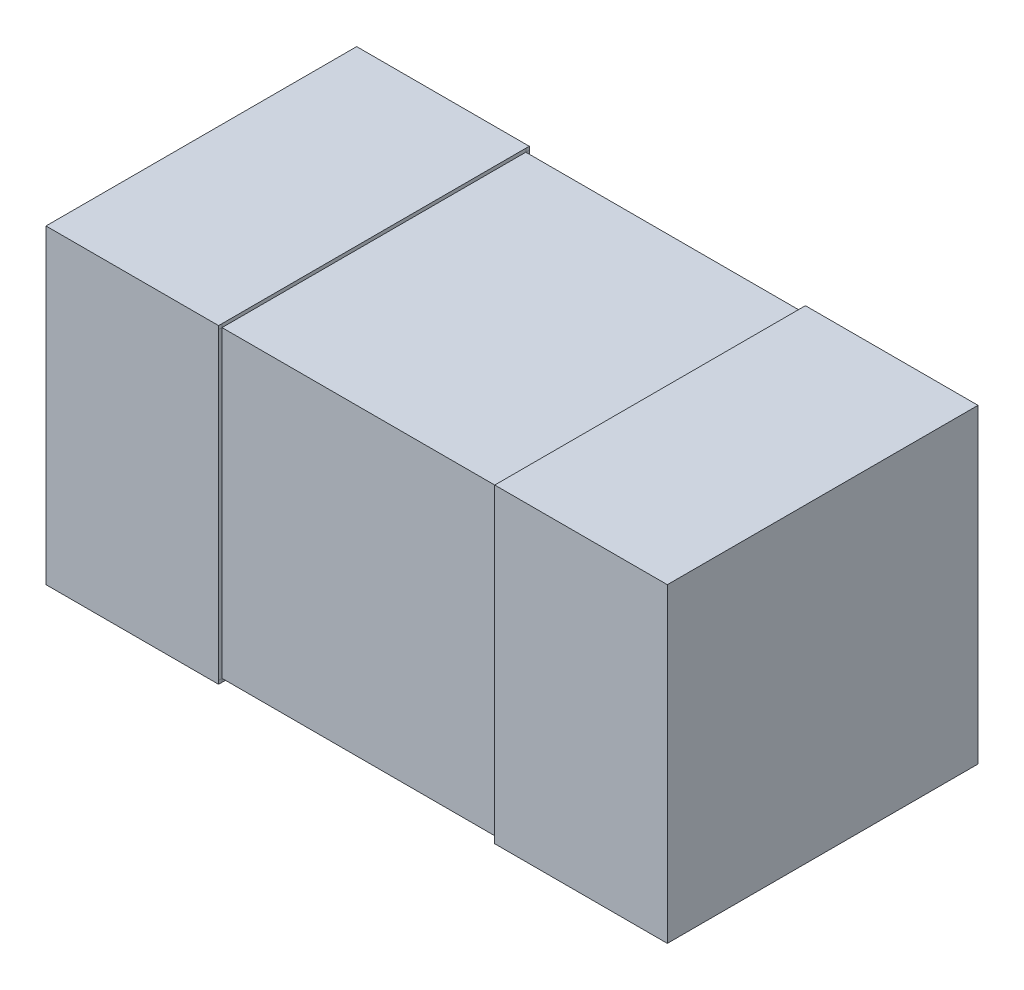
ISO-10303-21;
HEADER;
FILE_DESCRIPTION(('STEP AP214'),'2;1');
FILE_NAME('part.step','',(''),(''),'','','');
FILE_SCHEMA(('AUTOMOTIVE_DESIGN { 1 0 10303 214 1 1 1 1 }'));
ENDSEC;
DATA;
#1=APPLICATION_CONTEXT('core data for automotive mechanical design processes');
#2=APPLICATION_PROTOCOL_DEFINITION('international standard','automotive_design',2000,#1);
#3=PRODUCT_CONTEXT('',#1,'mechanical');
#4=PRODUCT('Part','Part','',(#3));
#5=PRODUCT_RELATED_PRODUCT_CATEGORY('part','',(#4));
#6=PRODUCT_DEFINITION_FORMATION('','',#4);
#7=PRODUCT_DEFINITION_CONTEXT('part definition',#1,'design');
#8=PRODUCT_DEFINITION('design','',#6,#7);
#9=PRODUCT_DEFINITION_SHAPE('','',#8);
#10=(LENGTH_UNIT() NAMED_UNIT(*) SI_UNIT(.MILLI.,.METRE.));
#11=(NAMED_UNIT(*) PLANE_ANGLE_UNIT() SI_UNIT($,.RADIAN.));
#12=(NAMED_UNIT(*) SI_UNIT($,.STERADIAN.) SOLID_ANGLE_UNIT());
#13=UNCERTAINTY_MEASURE_WITH_UNIT(LENGTH_MEASURE(1.E-05),#10,'distance_accuracy_value','');
#14=(GEOMETRIC_REPRESENTATION_CONTEXT(3) GLOBAL_UNCERTAINTY_ASSIGNED_CONTEXT((#13)) GLOBAL_UNIT_ASSIGNED_CONTEXT((#10,
#11,#12)) REPRESENTATION_CONTEXT('',''));
#15=CARTESIAN_POINT('',(0.,0.,0.));
#16=DIRECTION('',(0.,0.,1.));
#17=DIRECTION('',(1.,0.,0.));
#18=AXIS2_PLACEMENT_3D('',#15,#16,#17);
#19=CARTESIAN_POINT('',(-0.9,0.45,-0.45));
#20=DIRECTION('',(0.,0.,-1.));
#21=DIRECTION('',(0.,-1.,0.));
#22=AXIS2_PLACEMENT_3D('',#19,#20,#21);
#23=PLANE('',#22);
#24=DIRECTION('',(0.,1.,0.));
#25=VECTOR('',#24,1.);
#26=CARTESIAN_POINT('',(0.4,-0.45,-0.45));
#27=LINE('',#26,#25);
#28=CARTESIAN_POINT('',(0.4,-0.44,-0.45));
#29=VERTEX_POINT('',#28);
#30=CARTESIAN_POINT('',(0.4,0.44,-0.45));
#31=VERTEX_POINT('',#30);
#32=EDGE_CURVE('E332',#29,#31,#27,.T.);
#33=ORIENTED_EDGE('',*,*,#32,.T.);
#34=DIRECTION('',(0.,1.,0.));
#35=VECTOR('',#34,1.);
#36=CARTESIAN_POINT('',(0.4,-0.45,-0.45));
#37=LINE('',#36,#35);
#38=CARTESIAN_POINT('',(0.4,0.45,-0.45));
#39=VERTEX_POINT('',#38);
#40=EDGE_CURVE('E290',#31,#39,#37,.T.);
#41=ORIENTED_EDGE('',*,*,#40,.T.);
#42=DIRECTION('',(1.,0.,0.));
#43=VECTOR('',#42,1.);
#44=CARTESIAN_POINT('',(-0.9,0.45,-0.45));
#45=LINE('',#44,#43);
#46=CARTESIAN_POINT('',(0.9,0.45,-0.45));
#47=VERTEX_POINT('',#46);
#48=EDGE_CURVE('E291',#39,#47,#45,.T.);
#49=ORIENTED_EDGE('',*,*,#48,.T.);
#50=DIRECTION('',(0.,-1.,0.));
#51=VECTOR('',#50,1.);
#52=CARTESIAN_POINT('',(0.9,0.45,-0.45));
#53=LINE('',#52,#51);
#54=CARTESIAN_POINT('',(0.9,-0.45,-0.45));
#55=VERTEX_POINT('',#54);
#56=EDGE_CURVE('E11',#47,#55,#53,.T.);
#57=ORIENTED_EDGE('',*,*,#56,.T.);
#58=DIRECTION('',(1.,0.,0.));
#59=VECTOR('',#58,1.);
#60=CARTESIAN_POINT('',(-0.9,-0.45,-0.45));
#61=LINE('',#60,#59);
#62=CARTESIAN_POINT('',(0.4,-0.45,-0.45));
#63=VERTEX_POINT('',#62);
#64=EDGE_CURVE('E362',#63,#55,#61,.T.);
#65=ORIENTED_EDGE('',*,*,#64,.F.);
#66=DIRECTION('',(0.,-1.,0.));
#67=VECTOR('',#66,1.);
#68=CARTESIAN_POINT('',(0.4,0.,-0.45));
#69=LINE('',#68,#67);
#70=EDGE_CURVE('E430',#29,#63,#69,.T.);
#71=ORIENTED_EDGE('',*,*,#70,.F.);
#72=EDGE_LOOP('',(#33,#41,#49,#57,#65,#71));
#73=FACE_BOUND('',#72,.T.);
#74=ADVANCED_FACE('F16',(#73),#23,.T.);
#75=CARTESIAN_POINT('',(0.9,0.,0.));
#76=DIRECTION('',(-1.,0.,0.));
#77=DIRECTION('',(0.,0.,1.));
#78=AXIS2_PLACEMENT_3D('',#75,#76,#77);
#79=PLANE('',#78);
#80=DIRECTION('',(0.,0.,1.));
#81=VECTOR('',#80,1.);
#82=CARTESIAN_POINT('',(0.9,-0.45,-0.45));
#83=LINE('',#82,#81);
#84=CARTESIAN_POINT('',(0.9,-0.45,0.45));
#85=VERTEX_POINT('',#84);
#86=EDGE_CURVE('E27',#55,#85,#83,.T.);
#87=ORIENTED_EDGE('',*,*,#86,.F.);
#88=ORIENTED_EDGE('',*,*,#56,.F.);
#89=DIRECTION('',(0.,0.,-1.));
#90=VECTOR('',#89,1.);
#91=CARTESIAN_POINT('',(0.9,0.45,0.45));
#92=LINE('',#91,#90);
#93=CARTESIAN_POINT('',(0.9,0.45,0.45));
#94=VERTEX_POINT('',#93);
#95=EDGE_CURVE('E152',#94,#47,#92,.T.);
#96=ORIENTED_EDGE('',*,*,#95,.F.);
#97=DIRECTION('',(0.,1.,0.));
#98=VECTOR('',#97,1.);
#99=CARTESIAN_POINT('',(0.9,-0.45,0.45));
#100=LINE('',#99,#98);
#101=EDGE_CURVE('E345',#85,#94,#100,.T.);
#102=ORIENTED_EDGE('',*,*,#101,.F.);
#103=EDGE_LOOP('',(#87,#88,#96,#102));
#104=FACE_BOUND('',#103,.T.);
#105=ADVANCED_FACE('F480',(#104),#79,.F.);
#106=CARTESIAN_POINT('',(-0.9,-0.45,-0.45));
#107=DIRECTION('',(0.,-1.,0.));
#108=DIRECTION('',(-1.,0.,0.));
#109=AXIS2_PLACEMENT_3D('',#106,#107,#108);
#110=PLANE('',#109);
#111=DIRECTION('',(0.,0.,-1.));
#112=VECTOR('',#111,1.);
#113=CARTESIAN_POINT('',(0.4,-0.45,0.45));
#114=LINE('',#113,#112);
#115=CARTESIAN_POINT('',(0.4,-0.45,0.45));
#116=VERTEX_POINT('',#115);
#117=CARTESIAN_POINT('',(0.4,-0.45,0.44));
#118=VERTEX_POINT('',#117);
#119=EDGE_CURVE('E447',#116,#118,#114,.T.);
#120=ORIENTED_EDGE('',*,*,#119,.T.);
#121=DIRECTION('',(0.,0.,-1.));
#122=VECTOR('',#121,1.);
#123=CARTESIAN_POINT('',(0.4,-0.45,0.45));
#124=LINE('',#123,#122);
#125=CARTESIAN_POINT('',(0.4,-0.45,-0.44));
#126=VERTEX_POINT('',#125);
#127=EDGE_CURVE('E253',#118,#126,#124,.T.);
#128=ORIENTED_EDGE('',*,*,#127,.T.);
#129=DIRECTION('',(0.,0.,-1.));
#130=VECTOR('',#129,1.);
#131=CARTESIAN_POINT('',(0.4,-0.45,0.45));
#132=LINE('',#131,#130);
#133=EDGE_CURVE('E365',#126,#63,#132,.T.);
#134=ORIENTED_EDGE('',*,*,#133,.T.);
#135=ORIENTED_EDGE('',*,*,#64,.T.);
#136=ORIENTED_EDGE('',*,*,#86,.T.);
#137=DIRECTION('',(1.,0.,0.));
#138=VECTOR('',#137,1.);
#139=CARTESIAN_POINT('',(-0.9,-0.45,0.45));
#140=LINE('',#139,#138);
#141=EDGE_CURVE('E350',#116,#85,#140,.T.);
#142=ORIENTED_EDGE('',*,*,#141,.F.);
#143=EDGE_LOOP('',(#120,#128,#134,#135,#136,#142));
#144=FACE_BOUND('',#143,.T.);
#145=ADVANCED_FACE('F481',(#144),#110,.T.);
#146=CARTESIAN_POINT('',(0.4,-0.45,0.45));
#147=DIRECTION('',(1.,0.,0.));
#148=DIRECTION('',(0.,0.,1.));
#149=AXIS2_PLACEMENT_3D('',#146,#147,#148);
#150=PLANE('',#149);
#151=DIRECTION('',(0.,0.,-1.));
#152=VECTOR('',#151,1.);
#153=CARTESIAN_POINT('',(0.4,-0.44,0.45));
#154=LINE('',#153,#152);
#155=CARTESIAN_POINT('',(0.4,-0.44,-0.44));
#156=VERTEX_POINT('',#155);
#157=EDGE_CURVE('E328',#156,#29,#154,.T.);
#158=ORIENTED_EDGE('',*,*,#157,.T.);
#159=ORIENTED_EDGE('',*,*,#70,.T.);
#160=ORIENTED_EDGE('',*,*,#133,.F.);
#161=DIRECTION('',(0.,1.,0.));
#162=VECTOR('',#161,1.);
#163=CARTESIAN_POINT('',(0.4,-0.45,-0.44));
#164=LINE('',#163,#162);
#165=EDGE_CURVE('E378',#126,#156,#164,.T.);
#166=ORIENTED_EDGE('',*,*,#165,.T.);
#167=EDGE_LOOP('',(#158,#159,#160,#166));
#168=FACE_BOUND('',#167,.T.);
#169=ADVANCED_FACE('F484',(#168),#150,.F.);
#170=CARTESIAN_POINT('',(0.4,-0.45,-0.45));
#171=DIRECTION('',(1.,0.,0.));
#172=DIRECTION('',(0.,-1.,0.));
#173=AXIS2_PLACEMENT_3D('',#170,#171,#172);
#174=PLANE('',#173);
#175=DIRECTION('',(0.,0.,-1.));
#176=VECTOR('',#175,1.);
#177=CARTESIAN_POINT('',(0.4,0.45,0.));
#178=LINE('',#177,#176);
#179=CARTESIAN_POINT('',(0.4,0.45,-0.44));
#180=VERTEX_POINT('',#179);
#181=EDGE_CURVE('E286',#180,#39,#178,.T.);
#182=ORIENTED_EDGE('',*,*,#181,.T.);
#183=ORIENTED_EDGE('',*,*,#40,.F.);
#184=DIRECTION('',(0.,0.,1.));
#185=VECTOR('',#184,1.);
#186=CARTESIAN_POINT('',(0.4,0.44,-0.45));
#187=LINE('',#186,#185);
#188=CARTESIAN_POINT('',(0.4,0.44,-0.44));
#189=VERTEX_POINT('',#188);
#190=EDGE_CURVE('E408',#31,#189,#187,.T.);
#191=ORIENTED_EDGE('',*,*,#190,.T.);
#192=DIRECTION('',(0.,1.,0.));
#193=VECTOR('',#192,1.);
#194=CARTESIAN_POINT('',(0.4,-0.45,-0.44));
#195=LINE('',#194,#193);
#196=EDGE_CURVE('E336',#189,#180,#195,.T.);
#197=ORIENTED_EDGE('',*,*,#196,.T.);
#198=EDGE_LOOP('',(#182,#183,#191,#197));
#199=FACE_BOUND('',#198,.T.);
#200=ADVANCED_FACE('F476',(#199),#174,.F.);
#201=CARTESIAN_POINT('',(-0.9,0.45,0.45));
#202=DIRECTION('',(0.,1.,0.));
#203=DIRECTION('',(1.,0.,0.));
#204=AXIS2_PLACEMENT_3D('',#201,#202,#203);
#205=PLANE('',#204);
#206=DIRECTION('',(0.,0.,1.));
#207=VECTOR('',#206,1.);
#208=CARTESIAN_POINT('',(0.4,0.45,-0.45));
#209=LINE('',#208,#207);
#210=CARTESIAN_POINT('',(0.4,0.45,0.44));
#211=VERTEX_POINT('',#210);
#212=EDGE_CURVE('E306',#180,#211,#209,.T.);
#213=ORIENTED_EDGE('',*,*,#212,.T.);
#214=DIRECTION('',(0.,0.,1.));
#215=VECTOR('',#214,1.);
#216=CARTESIAN_POINT('',(0.4,0.45,-0.45));
#217=LINE('',#216,#215);
#218=CARTESIAN_POINT('',(0.4,0.45,0.45));
#219=VERTEX_POINT('',#218);
#220=EDGE_CURVE('E355',#211,#219,#217,.T.);
#221=ORIENTED_EDGE('',*,*,#220,.T.);
#222=DIRECTION('',(1.,0.,0.));
#223=VECTOR('',#222,1.);
#224=CARTESIAN_POINT('',(-0.9,0.45,0.45));
#225=LINE('',#224,#223);
#226=EDGE_CURVE('E349',#219,#94,#225,.T.);
#227=ORIENTED_EDGE('',*,*,#226,.T.);
#228=ORIENTED_EDGE('',*,*,#95,.T.);
#229=ORIENTED_EDGE('',*,*,#48,.F.);
#230=ORIENTED_EDGE('',*,*,#181,.F.);
#231=EDGE_LOOP('',(#213,#221,#227,#228,#229,#230));
#232=FACE_BOUND('',#231,.T.);
#233=ADVANCED_FACE('F478',(#232),#205,.T.);
#234=CARTESIAN_POINT('',(0.4,-0.45,-0.45));
#235=DIRECTION('',(1.,0.,0.));
#236=DIRECTION('',(0.,-1.,0.));
#237=AXIS2_PLACEMENT_3D('',#234,#235,#236);
#238=PLANE('',#237);
#239=ORIENTED_EDGE('',*,*,#190,.F.);
#240=ORIENTED_EDGE('',*,*,#32,.F.);
#241=ORIENTED_EDGE('',*,*,#157,.F.);
#242=DIRECTION('',(0.,1.,0.));
#243=VECTOR('',#242,1.);
#244=CARTESIAN_POINT('',(0.4,-0.45,-0.44));
#245=LINE('',#244,#243);
#246=EDGE_CURVE('E307',#156,#189,#245,.T.);
#247=ORIENTED_EDGE('',*,*,#246,.T.);
#248=EDGE_LOOP('',(#239,#240,#241,#247));
#249=FACE_BOUND('',#248,.T.);
#250=ADVANCED_FACE('F488',(#249),#238,.F.);
#251=CARTESIAN_POINT('',(-0.9,-0.45,0.45));
#252=DIRECTION('',(0.,0.,1.));
#253=DIRECTION('',(0.,-1.,0.));
#254=AXIS2_PLACEMENT_3D('',#251,#252,#253);
#255=PLANE('',#254);
#256=DIRECTION('',(0.,-1.,0.));
#257=VECTOR('',#256,1.);
#258=CARTESIAN_POINT('',(0.4,0.45,0.45));
#259=LINE('',#258,#257);
#260=CARTESIAN_POINT('',(0.4,0.44,0.45));
#261=VERTEX_POINT('',#260);
#262=CARTESIAN_POINT('',(0.4,-0.44,0.45));
#263=VERTEX_POINT('',#262);
#264=EDGE_CURVE('E275',#261,#263,#259,.T.);
#265=ORIENTED_EDGE('',*,*,#264,.T.);
#266=DIRECTION('',(0.,1.,0.));
#267=VECTOR('',#266,1.);
#268=CARTESIAN_POINT('',(0.4,-0.45,0.45));
#269=LINE('',#268,#267);
#270=EDGE_CURVE('E450',#116,#263,#269,.T.);
#271=ORIENTED_EDGE('',*,*,#270,.F.);
#272=ORIENTED_EDGE('',*,*,#141,.T.);
#273=ORIENTED_EDGE('',*,*,#101,.T.);
#274=ORIENTED_EDGE('',*,*,#226,.F.);
#275=DIRECTION('',(0.,1.,0.));
#276=VECTOR('',#275,1.);
#277=CARTESIAN_POINT('',(0.4,0.,0.45));
#278=LINE('',#277,#276);
#279=EDGE_CURVE('E351',#261,#219,#278,.T.);
#280=ORIENTED_EDGE('',*,*,#279,.F.);
#281=EDGE_LOOP('',(#265,#271,#272,#273,#274,#280));
#282=FACE_BOUND('',#281,.T.);
#283=ADVANCED_FACE('F507',(#282),#255,.T.);
#284=CARTESIAN_POINT('',(0.4,-0.45,0.45));
#285=DIRECTION('',(1.,0.,0.));
#286=DIRECTION('',(0.,0.,1.));
#287=AXIS2_PLACEMENT_3D('',#284,#285,#286);
#288=PLANE('',#287);
#289=DIRECTION('',(0.,0.,-1.));
#290=VECTOR('',#289,1.);
#291=CARTESIAN_POINT('',(0.4,-0.44,0.45));
#292=LINE('',#291,#290);
#293=CARTESIAN_POINT('',(0.4,-0.44,0.44));
#294=VERTEX_POINT('',#293);
#295=EDGE_CURVE('E271',#263,#294,#292,.T.);
#296=ORIENTED_EDGE('',*,*,#295,.T.);
#297=DIRECTION('',(0.,-1.,0.));
#298=VECTOR('',#297,1.);
#299=CARTESIAN_POINT('',(0.4,0.45,0.44));
#300=LINE('',#299,#298);
#301=EDGE_CURVE('E356',#294,#118,#300,.T.);
#302=ORIENTED_EDGE('',*,*,#301,.T.);
#303=ORIENTED_EDGE('',*,*,#119,.F.);
#304=ORIENTED_EDGE('',*,*,#270,.T.);
#305=EDGE_LOOP('',(#296,#302,#303,#304));
#306=FACE_BOUND('',#305,.T.);
#307=ADVANCED_FACE('F513',(#306),#288,.F.);
#308=CARTESIAN_POINT('',(0.4,0.45,-0.45));
#309=DIRECTION('',(1.,0.,0.));
#310=DIRECTION('',(0.,0.,-1.));
#311=AXIS2_PLACEMENT_3D('',#308,#309,#310);
#312=PLANE('',#311);
#313=ORIENTED_EDGE('',*,*,#279,.T.);
#314=ORIENTED_EDGE('',*,*,#220,.F.);
#315=DIRECTION('',(0.,-1.,0.));
#316=VECTOR('',#315,1.);
#317=CARTESIAN_POINT('',(0.4,0.45,0.44));
#318=LINE('',#317,#316);
#319=CARTESIAN_POINT('',(0.4,0.44,0.44));
#320=VERTEX_POINT('',#319);
#321=EDGE_CURVE('E303',#211,#320,#318,.T.);
#322=ORIENTED_EDGE('',*,*,#321,.T.);
#323=DIRECTION('',(0.,0.,1.));
#324=VECTOR('',#323,1.);
#325=CARTESIAN_POINT('',(0.4,0.44,-0.45));
#326=LINE('',#325,#324);
#327=EDGE_CURVE('E327',#320,#261,#326,.T.);
#328=ORIENTED_EDGE('',*,*,#327,.T.);
#329=EDGE_LOOP('',(#313,#314,#322,#328));
#330=FACE_BOUND('',#329,.T.);
#331=ADVANCED_FACE('F503',(#330),#312,.F.);
#332=CARTESIAN_POINT('',(0.4,-0.45,0.45));
#333=DIRECTION('',(1.,0.,0.));
#334=DIRECTION('',(0.,0.,1.));
#335=AXIS2_PLACEMENT_3D('',#332,#333,#334);
#336=PLANE('',#335);
#337=DIRECTION('',(0.,0.,-1.));
#338=VECTOR('',#337,1.);
#339=CARTESIAN_POINT('',(0.4,-0.44,0.45));
#340=LINE('',#339,#338);
#341=EDGE_CURVE('E276',#294,#156,#340,.T.);
#342=ORIENTED_EDGE('',*,*,#341,.T.);
#343=ORIENTED_EDGE('',*,*,#165,.F.);
#344=ORIENTED_EDGE('',*,*,#127,.F.);
#345=ORIENTED_EDGE('',*,*,#301,.F.);
#346=EDGE_LOOP('',(#342,#343,#344,#345));
#347=FACE_BOUND('',#346,.T.);
#348=ADVANCED_FACE('F516',(#347),#336,.F.);
#349=CARTESIAN_POINT('',(0.4,0.45,-0.45));
#350=DIRECTION('',(1.,0.,0.));
#351=DIRECTION('',(0.,0.,-1.));
#352=AXIS2_PLACEMENT_3D('',#349,#350,#351);
#353=PLANE('',#352);
#354=ORIENTED_EDGE('',*,*,#321,.F.);
#355=ORIENTED_EDGE('',*,*,#212,.F.);
#356=ORIENTED_EDGE('',*,*,#196,.F.);
#357=DIRECTION('',(0.,0.,1.));
#358=VECTOR('',#357,1.);
#359=CARTESIAN_POINT('',(0.4,0.44,-0.45));
#360=LINE('',#359,#358);
#361=EDGE_CURVE('E255',#189,#320,#360,.T.);
#362=ORIENTED_EDGE('',*,*,#361,.T.);
#363=EDGE_LOOP('',(#354,#355,#356,#362));
#364=FACE_BOUND('',#363,.T.);
#365=ADVANCED_FACE('F501',(#364),#353,.F.);
#366=CARTESIAN_POINT('',(0.4,-0.45,-0.44));
#367=DIRECTION('',(0.,0.,1.));
#368=DIRECTION('',(0.,-1.,0.));
#369=AXIS2_PLACEMENT_3D('',#366,#367,#368);
#370=PLANE('',#369);
#371=DIRECTION('',(1.,0.,0.));
#372=VECTOR('',#371,1.);
#373=CARTESIAN_POINT('',(0.4,0.44,-0.44));
#374=LINE('',#373,#372);
#375=CARTESIAN_POINT('',(-0.4,0.44,-0.44));
#376=VERTEX_POINT('',#375);
#377=EDGE_CURVE('E259',#376,#189,#374,.T.);
#378=ORIENTED_EDGE('',*,*,#377,.T.);
#379=ORIENTED_EDGE('',*,*,#246,.F.);
#380=DIRECTION('',(1.,0.,0.));
#381=VECTOR('',#380,1.);
#382=CARTESIAN_POINT('',(0.4,-0.44,-0.44));
#383=LINE('',#382,#381);
#384=CARTESIAN_POINT('',(-0.4,-0.44,-0.44));
#385=VERTEX_POINT('',#384);
#386=EDGE_CURVE('E299',#385,#156,#383,.T.);
#387=ORIENTED_EDGE('',*,*,#386,.F.);
#388=DIRECTION('',(0.,1.,0.));
#389=VECTOR('',#388,1.);
#390=CARTESIAN_POINT('',(-0.4,-0.45,-0.44));
#391=LINE('',#390,#389);
#392=EDGE_CURVE('E260',#385,#376,#391,.T.);
#393=ORIENTED_EDGE('',*,*,#392,.T.);
#394=EDGE_LOOP('',(#378,#379,#387,#393));
#395=FACE_BOUND('',#394,.T.);
#396=ADVANCED_FACE('F493',(#395),#370,.F.);
#397=CARTESIAN_POINT('',(0.4,0.45,0.45));
#398=DIRECTION('',(1.,0.,0.));
#399=DIRECTION('',(0.,1.,0.));
#400=AXIS2_PLACEMENT_3D('',#397,#398,#399);
#401=PLANE('',#400);
#402=DIRECTION('',(0.,-1.,0.));
#403=VECTOR('',#402,1.);
#404=CARTESIAN_POINT('',(0.4,0.45,0.44));
#405=LINE('',#404,#403);
#406=EDGE_CURVE('E281',#320,#294,#405,.T.);
#407=ORIENTED_EDGE('',*,*,#406,.T.);
#408=ORIENTED_EDGE('',*,*,#295,.F.);
#409=ORIENTED_EDGE('',*,*,#264,.F.);
#410=ORIENTED_EDGE('',*,*,#327,.F.);
#411=EDGE_LOOP('',(#407,#408,#409,#410));
#412=FACE_BOUND('',#411,.T.);
#413=ADVANCED_FACE('F813',(#412),#401,.F.);
#414=CARTESIAN_POINT('',(0.4,-0.44,0.45));
#415=DIRECTION('',(0.,1.,0.));
#416=DIRECTION('',(0.,0.,-1.));
#417=AXIS2_PLACEMENT_3D('',#414,#415,#416);
#418=PLANE('',#417);
#419=DIRECTION('',(0.,0.,-1.));
#420=VECTOR('',#419,1.);
#421=CARTESIAN_POINT('',(-0.4,-0.44,0.45));
#422=LINE('',#421,#420);
#423=CARTESIAN_POINT('',(-0.4,-0.44,0.44));
#424=VERTEX_POINT('',#423);
#425=EDGE_CURVE('E285',#424,#385,#422,.T.);
#426=ORIENTED_EDGE('',*,*,#425,.T.);
#427=ORIENTED_EDGE('',*,*,#386,.T.);
#428=ORIENTED_EDGE('',*,*,#341,.F.);
#429=DIRECTION('',(-1.,0.,0.));
#430=VECTOR('',#429,1.);
#431=CARTESIAN_POINT('',(0.4,-0.44,0.44));
#432=LINE('',#431,#430);
#433=EDGE_CURVE('E277',#294,#424,#432,.T.);
#434=ORIENTED_EDGE('',*,*,#433,.T.);
#435=EDGE_LOOP('',(#426,#427,#428,#434));
#436=FACE_BOUND('',#435,.T.);
#437=ADVANCED_FACE('F818',(#436),#418,.F.);
#438=CARTESIAN_POINT('',(0.4,0.44,-0.45));
#439=DIRECTION('',(0.,-1.,0.));
#440=DIRECTION('',(-1.,0.,0.));
#441=AXIS2_PLACEMENT_3D('',#438,#439,#440);
#442=PLANE('',#441);
#443=DIRECTION('',(1.,0.,0.));
#444=VECTOR('',#443,1.);
#445=CARTESIAN_POINT('',(0.4,0.44,0.44));
#446=LINE('',#445,#444);
#447=CARTESIAN_POINT('',(-0.4,0.44,0.44));
#448=VERTEX_POINT('',#447);
#449=EDGE_CURVE('E295',#448,#320,#446,.T.);
#450=ORIENTED_EDGE('',*,*,#449,.T.);
#451=ORIENTED_EDGE('',*,*,#361,.F.);
#452=ORIENTED_EDGE('',*,*,#377,.F.);
#453=DIRECTION('',(0.,0.,1.));
#454=VECTOR('',#453,1.);
#455=CARTESIAN_POINT('',(-0.4,0.44,-0.45));
#456=LINE('',#455,#454);
#457=EDGE_CURVE('E264',#376,#448,#456,.T.);
#458=ORIENTED_EDGE('',*,*,#457,.T.);
#459=EDGE_LOOP('',(#450,#451,#452,#458));
#460=FACE_BOUND('',#459,.T.);
#461=ADVANCED_FACE('F497',(#460),#442,.F.);
#462=CARTESIAN_POINT('',(-0.4,-0.45,-0.44));
#463=DIRECTION('',(-1.,0.,0.));
#464=DIRECTION('',(0.,0.,1.));
#465=AXIS2_PLACEMENT_3D('',#462,#463,#464);
#466=PLANE('',#465);
#467=DIRECTION('',(0.,1.,0.));
#468=VECTOR('',#467,1.);
#469=CARTESIAN_POINT('',(-0.4,-0.45,-0.45));
#470=LINE('',#469,#468);
#471=CARTESIAN_POINT('',(-0.4,-0.44,-0.45));
#472=VERTEX_POINT('',#471);
#473=CARTESIAN_POINT('',(-0.4,0.44,-0.45));
#474=VERTEX_POINT('',#473);
#475=EDGE_CURVE('E316',#472,#474,#470,.T.);
#476=ORIENTED_EDGE('',*,*,#475,.T.);
#477=DIRECTION('',(0.,0.,1.));
#478=VECTOR('',#477,1.);
#479=CARTESIAN_POINT('',(-0.4,0.44,-0.45));
#480=LINE('',#479,#478);
#481=EDGE_CURVE('E261',#474,#376,#480,.T.);
#482=ORIENTED_EDGE('',*,*,#481,.T.);
#483=ORIENTED_EDGE('',*,*,#392,.F.);
#484=DIRECTION('',(0.,0.,-1.));
#485=VECTOR('',#484,1.);
#486=CARTESIAN_POINT('',(-0.4,-0.44,0.45));
#487=LINE('',#486,#485);
#488=EDGE_CURVE('E282',#385,#472,#487,.T.);
#489=ORIENTED_EDGE('',*,*,#488,.T.);
#490=EDGE_LOOP('',(#476,#482,#483,#489));
#491=FACE_BOUND('',#490,.T.);
#492=ADVANCED_FACE('F831',(#491),#466,.F.);
#493=CARTESIAN_POINT('',(-0.4,-0.44,0.45));
#494=DIRECTION('',(-1.,0.,0.));
#495=DIRECTION('',(0.,0.,1.));
#496=AXIS2_PLACEMENT_3D('',#493,#494,#495);
#497=PLANE('',#496);
#498=DIRECTION('',(0.,0.,-1.));
#499=VECTOR('',#498,1.);
#500=CARTESIAN_POINT('',(-0.4,-0.45,0.45));
#501=LINE('',#500,#499);
#502=CARTESIAN_POINT('',(-0.4,-0.45,-0.44));
#503=VERTEX_POINT('',#502);
#504=CARTESIAN_POINT('',(-0.4,-0.45,-0.45));
#505=VERTEX_POINT('',#504);
#506=EDGE_CURVE('E314',#503,#505,#501,.T.);
#507=ORIENTED_EDGE('',*,*,#506,.T.);
#508=DIRECTION('',(0.,1.,0.));
#509=VECTOR('',#508,1.);
#510=CARTESIAN_POINT('',(-0.4,0.005,-0.45));
#511=LINE('',#510,#509);
#512=EDGE_CURVE('E320',#505,#472,#511,.T.);
#513=ORIENTED_EDGE('',*,*,#512,.T.);
#514=ORIENTED_EDGE('',*,*,#488,.F.);
#515=DIRECTION('',(0.,1.,0.));
#516=VECTOR('',#515,1.);
#517=CARTESIAN_POINT('',(-0.4,-0.45,-0.44));
#518=LINE('',#517,#516);
#519=EDGE_CURVE('E382',#503,#385,#518,.T.);
#520=ORIENTED_EDGE('',*,*,#519,.F.);
#521=EDGE_LOOP('',(#507,#513,#514,#520));
#522=FACE_BOUND('',#521,.T.);
#523=ADVANCED_FACE('F839',(#522),#497,.F.);
#524=CARTESIAN_POINT('',(-0.4,-0.44,0.45));
#525=DIRECTION('',(-1.,0.,0.));
#526=DIRECTION('',(0.,0.,1.));
#527=AXIS2_PLACEMENT_3D('',#524,#525,#526);
#528=PLANE('',#527);
#529=DIRECTION('',(0.,0.,-1.));
#530=VECTOR('',#529,1.);
#531=CARTESIAN_POINT('',(-0.4,-0.45,0.45));
#532=LINE('',#531,#530);
#533=CARTESIAN_POINT('',(-0.4,-0.45,0.44));
#534=VERTEX_POINT('',#533);
#535=EDGE_CURVE('E310',#534,#503,#532,.T.);
#536=ORIENTED_EDGE('',*,*,#535,.T.);
#537=ORIENTED_EDGE('',*,*,#519,.T.);
#538=ORIENTED_EDGE('',*,*,#425,.F.);
#539=DIRECTION('',(0.,-1.,0.));
#540=VECTOR('',#539,1.);
#541=CARTESIAN_POINT('',(-0.4,0.45,0.44));
#542=LINE('',#541,#540);
#543=EDGE_CURVE('E223',#424,#534,#542,.T.);
#544=ORIENTED_EDGE('',*,*,#543,.T.);
#545=EDGE_LOOP('',(#536,#537,#538,#544));
#546=FACE_BOUND('',#545,.T.);
#547=ADVANCED_FACE('F844',(#546),#528,.F.);
#548=CARTESIAN_POINT('',(0.4,0.45,0.44));
#549=DIRECTION('',(0.,0.,-1.));
#550=DIRECTION('',(0.,-1.,0.));
#551=AXIS2_PLACEMENT_3D('',#548,#549,#550);
#552=PLANE('',#551);
#553=DIRECTION('',(0.,-1.,0.));
#554=VECTOR('',#553,1.);
#555=CARTESIAN_POINT('',(-0.4,0.45,0.44));
#556=LINE('',#555,#554);
#557=EDGE_CURVE('E228',#448,#424,#556,.T.);
#558=ORIENTED_EDGE('',*,*,#557,.T.);
#559=ORIENTED_EDGE('',*,*,#433,.F.);
#560=ORIENTED_EDGE('',*,*,#406,.F.);
#561=ORIENTED_EDGE('',*,*,#449,.F.);
#562=EDGE_LOOP('',(#558,#559,#560,#561));
#563=FACE_BOUND('',#562,.T.);
#564=ADVANCED_FACE('F18',(#563),#552,.F.);
#565=CARTESIAN_POINT('',(-0.4,0.44,-0.45));
#566=DIRECTION('',(-1.,0.,0.));
#567=DIRECTION('',(0.,1.,0.));
#568=AXIS2_PLACEMENT_3D('',#565,#566,#567);
#569=PLANE('',#568);
#570=DIRECTION('',(0.,0.,1.));
#571=VECTOR('',#570,1.);
#572=CARTESIAN_POINT('',(-0.4,0.45,-0.45));
#573=LINE('',#572,#571);
#574=CARTESIAN_POINT('',(-0.4,0.45,-0.44));
#575=VERTEX_POINT('',#574);
#576=CARTESIAN_POINT('',(-0.4,0.45,0.44));
#577=VERTEX_POINT('',#576);
#578=EDGE_CURVE('E405',#575,#577,#573,.T.);
#579=ORIENTED_EDGE('',*,*,#578,.T.);
#580=DIRECTION('',(0.,-1.,0.));
#581=VECTOR('',#580,1.);
#582=CARTESIAN_POINT('',(-0.4,0.45,0.44));
#583=LINE('',#582,#581);
#584=EDGE_CURVE('E229',#577,#448,#583,.T.);
#585=ORIENTED_EDGE('',*,*,#584,.T.);
#586=ORIENTED_EDGE('',*,*,#457,.F.);
#587=DIRECTION('',(0.,1.,0.));
#588=VECTOR('',#587,1.);
#589=CARTESIAN_POINT('',(-0.4,-0.45,-0.44));
#590=LINE('',#589,#588);
#591=EDGE_CURVE('E265',#376,#575,#590,.T.);
#592=ORIENTED_EDGE('',*,*,#591,.T.);
#593=EDGE_LOOP('',(#579,#585,#586,#592));
#594=FACE_BOUND('',#593,.T.);
#595=ADVANCED_FACE('F677',(#594),#569,.F.);
#596=CARTESIAN_POINT('',(-0.4,-0.45,-0.44));
#597=DIRECTION('',(-1.,0.,0.));
#598=DIRECTION('',(0.,0.,1.));
#599=AXIS2_PLACEMENT_3D('',#596,#597,#598);
#600=PLANE('',#599);
#601=DIRECTION('',(0.,1.,0.));
#602=VECTOR('',#601,1.);
#603=CARTESIAN_POINT('',(-0.4,-0.45,-0.45));
#604=LINE('',#603,#602);
#605=CARTESIAN_POINT('',(-0.4,0.45,-0.45));
#606=VERTEX_POINT('',#605);
#607=EDGE_CURVE('E313',#474,#606,#604,.T.);
#608=ORIENTED_EDGE('',*,*,#607,.T.);
#609=DIRECTION('',(0.,0.,1.));
#610=VECTOR('',#609,1.);
#611=CARTESIAN_POINT('',(-0.4,0.45,0.004999999999999));
#612=LINE('',#611,#610);
#613=EDGE_CURVE('E400',#606,#575,#612,.T.);
#614=ORIENTED_EDGE('',*,*,#613,.T.);
#615=ORIENTED_EDGE('',*,*,#591,.F.);
#616=ORIENTED_EDGE('',*,*,#481,.F.);
#617=EDGE_LOOP('',(#608,#614,#615,#616));
#618=FACE_BOUND('',#617,.T.);
#619=ADVANCED_FACE('F683',(#618),#600,.F.);
#620=CARTESIAN_POINT('',(-0.9,0.45,-0.45));
#621=DIRECTION('',(0.,0.,-1.));
#622=DIRECTION('',(0.,-1.,0.));
#623=AXIS2_PLACEMENT_3D('',#620,#621,#622);
#624=PLANE('',#623);
#625=DIRECTION('',(0.,-1.,0.));
#626=VECTOR('',#625,1.);
#627=CARTESIAN_POINT('',(-0.9,0.45,-0.45));
#628=LINE('',#627,#626);
#629=CARTESIAN_POINT('',(-0.9,0.45,-0.45));
#630=VERTEX_POINT('',#629);
#631=CARTESIAN_POINT('',(-0.9,-0.45,-0.45));
#632=VERTEX_POINT('',#631);
#633=EDGE_CURVE('E270',#630,#632,#628,.T.);
#634=ORIENTED_EDGE('',*,*,#633,.F.);
#635=DIRECTION('',(1.,0.,0.));
#636=VECTOR('',#635,1.);
#637=CARTESIAN_POINT('',(-0.9,0.45,-0.45));
#638=LINE('',#637,#636);
#639=EDGE_CURVE('E404',#630,#606,#638,.T.);
#640=ORIENTED_EDGE('',*,*,#639,.T.);
#641=ORIENTED_EDGE('',*,*,#607,.F.);
#642=ORIENTED_EDGE('',*,*,#475,.F.);
#643=ORIENTED_EDGE('',*,*,#512,.F.);
#644=DIRECTION('',(1.,0.,0.));
#645=VECTOR('',#644,1.);
#646=CARTESIAN_POINT('',(-0.9,-0.45,-0.45));
#647=LINE('',#646,#645);
#648=EDGE_CURVE('E343',#632,#505,#647,.T.);
#649=ORIENTED_EDGE('',*,*,#648,.F.);
#650=EDGE_LOOP('',(#634,#640,#641,#642,#643,#649));
#651=FACE_BOUND('',#650,.T.);
#652=ADVANCED_FACE('F761',(#651),#624,.T.);
#653=CARTESIAN_POINT('',(-0.9,-0.45,-0.45));
#654=DIRECTION('',(0.,-1.,0.));
#655=DIRECTION('',(-1.,0.,0.));
#656=AXIS2_PLACEMENT_3D('',#653,#654,#655);
#657=PLANE('',#656);
#658=DIRECTION('',(0.,0.,1.));
#659=VECTOR('',#658,1.);
#660=CARTESIAN_POINT('',(-0.9,-0.45,-0.45));
#661=LINE('',#660,#659);
#662=CARTESIAN_POINT('',(-0.9,-0.45,0.45));
#663=VERTEX_POINT('',#662);
#664=EDGE_CURVE('E87',#632,#663,#661,.T.);
#665=ORIENTED_EDGE('',*,*,#664,.F.);
#666=ORIENTED_EDGE('',*,*,#648,.T.);
#667=ORIENTED_EDGE('',*,*,#506,.F.);
#668=ORIENTED_EDGE('',*,*,#535,.F.);
#669=DIRECTION('',(0.,0.,-1.));
#670=VECTOR('',#669,1.);
#671=CARTESIAN_POINT('',(-0.4,-0.45,0.45));
#672=LINE('',#671,#670);
#673=CARTESIAN_POINT('',(-0.4,-0.45,0.45));
#674=VERTEX_POINT('',#673);
#675=EDGE_CURVE('E344',#674,#534,#672,.T.);
#676=ORIENTED_EDGE('',*,*,#675,.F.);
#677=DIRECTION('',(1.,0.,0.));
#678=VECTOR('',#677,1.);
#679=CARTESIAN_POINT('',(-0.9,-0.45,0.45));
#680=LINE('',#679,#678);
#681=EDGE_CURVE('E242',#663,#674,#680,.T.);
#682=ORIENTED_EDGE('',*,*,#681,.F.);
#683=EDGE_LOOP('',(#665,#666,#667,#668,#676,#682));
#684=FACE_BOUND('',#683,.T.);
#685=ADVANCED_FACE('F756',(#684),#657,.T.);
#686=CARTESIAN_POINT('',(-0.4,-0.44,0.45));
#687=DIRECTION('',(-1.,0.,0.));
#688=DIRECTION('',(0.,0.,1.));
#689=AXIS2_PLACEMENT_3D('',#686,#687,#688);
#690=PLANE('',#689);
#691=ORIENTED_EDGE('',*,*,#675,.T.);
#692=ORIENTED_EDGE('',*,*,#543,.F.);
#693=DIRECTION('',(0.,0.,-1.));
#694=VECTOR('',#693,1.);
#695=CARTESIAN_POINT('',(-0.4,-0.44,0.45));
#696=LINE('',#695,#694);
#697=CARTESIAN_POINT('',(-0.4,-0.44,0.45));
#698=VERTEX_POINT('',#697);
#699=EDGE_CURVE('E215',#698,#424,#696,.T.);
#700=ORIENTED_EDGE('',*,*,#699,.F.);
#701=DIRECTION('',(0.,-1.,0.));
#702=VECTOR('',#701,1.);
#703=CARTESIAN_POINT('',(-0.4,-0.44,0.45));
#704=LINE('',#703,#702);
#705=EDGE_CURVE('E220',#698,#674,#704,.T.);
#706=ORIENTED_EDGE('',*,*,#705,.T.);
#707=EDGE_LOOP('',(#691,#692,#700,#706));
#708=FACE_BOUND('',#707,.T.);
#709=ADVANCED_FACE('F218',(#708),#690,.F.);
#710=CARTESIAN_POINT('',(-0.4,0.45,0.44));
#711=DIRECTION('',(-1.,0.,0.));
#712=DIRECTION('',(0.,1.,0.));
#713=AXIS2_PLACEMENT_3D('',#710,#711,#712);
#714=PLANE('',#713);
#715=DIRECTION('',(0.,-1.,0.));
#716=VECTOR('',#715,1.);
#717=CARTESIAN_POINT('',(-0.4,0.45,0.45));
#718=LINE('',#717,#716);
#719=CARTESIAN_POINT('',(-0.4,0.44,0.45));
#720=VERTEX_POINT('',#719);
#721=EDGE_CURVE('E20',#720,#698,#718,.T.);
#722=ORIENTED_EDGE('',*,*,#721,.T.);
#723=ORIENTED_EDGE('',*,*,#699,.T.);
#724=ORIENTED_EDGE('',*,*,#557,.F.);
#725=DIRECTION('',(0.,0.,1.));
#726=VECTOR('',#725,1.);
#727=CARTESIAN_POINT('',(-0.4,0.44,-0.45));
#728=LINE('',#727,#726);
#729=EDGE_CURVE('E234',#448,#720,#728,.T.);
#730=ORIENTED_EDGE('',*,*,#729,.T.);
#731=EDGE_LOOP('',(#722,#723,#724,#730));
#732=FACE_BOUND('',#731,.T.);
#733=ADVANCED_FACE('F232',(#732),#714,.F.);
#734=CARTESIAN_POINT('',(-0.4,0.44,-0.45));
#735=DIRECTION('',(-1.,0.,0.));
#736=DIRECTION('',(0.,1.,0.));
#737=AXIS2_PLACEMENT_3D('',#734,#735,#736);
#738=PLANE('',#737);
#739=DIRECTION('',(0.,0.,1.));
#740=VECTOR('',#739,1.);
#741=CARTESIAN_POINT('',(-0.4,0.45,-0.45));
#742=LINE('',#741,#740);
#743=CARTESIAN_POINT('',(-0.4,0.45,0.45));
#744=VERTEX_POINT('',#743);
#745=EDGE_CURVE('E269',#577,#744,#742,.T.);
#746=ORIENTED_EDGE('',*,*,#745,.T.);
#747=DIRECTION('',(0.,-1.,0.));
#748=VECTOR('',#747,1.);
#749=CARTESIAN_POINT('',(-0.4,-0.004999999999999,0.45));
#750=LINE('',#749,#748);
#751=EDGE_CURVE('E239',#744,#720,#750,.T.);
#752=ORIENTED_EDGE('',*,*,#751,.T.);
#753=ORIENTED_EDGE('',*,*,#729,.F.);
#754=ORIENTED_EDGE('',*,*,#584,.F.);
#755=EDGE_LOOP('',(#746,#752,#753,#754));
#756=FACE_BOUND('',#755,.T.);
#757=ADVANCED_FACE('F721',(#756),#738,.F.);
#758=CARTESIAN_POINT('',(-0.9,0.45,0.45));
#759=DIRECTION('',(0.,1.,0.));
#760=DIRECTION('',(1.,0.,0.));
#761=AXIS2_PLACEMENT_3D('',#758,#759,#760);
#762=PLANE('',#761);
#763=DIRECTION('',(0.,0.,-1.));
#764=VECTOR('',#763,1.);
#765=CARTESIAN_POINT('',(-0.9,0.45,0.45));
#766=LINE('',#765,#764);
#767=CARTESIAN_POINT('',(-0.9,0.45,0.45));
#768=VERTEX_POINT('',#767);
#769=EDGE_CURVE('E100',#768,#630,#766,.T.);
#770=ORIENTED_EDGE('',*,*,#769,.F.);
#771=DIRECTION('',(1.,0.,0.));
#772=VECTOR('',#771,1.);
#773=CARTESIAN_POINT('',(-0.9,0.45,0.45));
#774=LINE('',#773,#772);
#775=EDGE_CURVE('E371',#768,#744,#774,.T.);
#776=ORIENTED_EDGE('',*,*,#775,.T.);
#777=ORIENTED_EDGE('',*,*,#745,.F.);
#778=ORIENTED_EDGE('',*,*,#578,.F.);
#779=ORIENTED_EDGE('',*,*,#613,.F.);
#780=ORIENTED_EDGE('',*,*,#639,.F.);
#781=EDGE_LOOP('',(#770,#776,#777,#778,#779,#780));
#782=FACE_BOUND('',#781,.T.);
#783=ADVANCED_FACE('F715',(#782),#762,.T.);
#784=CARTESIAN_POINT('',(-0.9,0.,0.));
#785=DIRECTION('',(-1.,0.,0.));
#786=DIRECTION('',(0.,0.,1.));
#787=AXIS2_PLACEMENT_3D('',#784,#785,#786);
#788=PLANE('',#787);
#789=DIRECTION('',(0.,1.,0.));
#790=VECTOR('',#789,1.);
#791=CARTESIAN_POINT('',(-0.9,-0.45,0.45));
#792=LINE('',#791,#790);
#793=EDGE_CURVE('E249',#663,#768,#792,.T.);
#794=ORIENTED_EDGE('',*,*,#793,.T.);
#795=ORIENTED_EDGE('',*,*,#769,.T.);
#796=ORIENTED_EDGE('',*,*,#633,.T.);
#797=ORIENTED_EDGE('',*,*,#664,.T.);
#798=EDGE_LOOP('',(#794,#795,#796,#797));
#799=FACE_BOUND('',#798,.T.);
#800=ADVANCED_FACE('F720',(#799),#788,.T.);
#801=CARTESIAN_POINT('',(-0.9,-0.45,0.45));
#802=DIRECTION('',(0.,0.,1.));
#803=DIRECTION('',(0.,-1.,0.));
#804=AXIS2_PLACEMENT_3D('',#801,#802,#803);
#805=PLANE('',#804);
#806=ORIENTED_EDGE('',*,*,#793,.F.);
#807=ORIENTED_EDGE('',*,*,#681,.T.);
#808=ORIENTED_EDGE('',*,*,#705,.F.);
#809=ORIENTED_EDGE('',*,*,#721,.F.);
#810=ORIENTED_EDGE('',*,*,#751,.F.);
#811=ORIENTED_EDGE('',*,*,#775,.F.);
#812=EDGE_LOOP('',(#806,#807,#808,#809,#810,#811));
#813=FACE_BOUND('',#812,.T.);
#814=ADVANCED_FACE('F241',(#813),#805,.T.);
#815=CLOSED_SHELL('',(#74,#105,#145,#169,#200,#233,#250,#283,#307,#331,#348,#365,#396,#413,#437,
#461,#492,#523,#547,#564,#595,#619,#652,#685,#709,#733,#757,#783,#800,#814));
#816=MANIFOLD_SOLID_BREP('B1',#815);
#817=ADVANCED_BREP_SHAPE_REPRESENTATION('',(#18,#816),#14);
#818=SHAPE_DEFINITION_REPRESENTATION(#9,#817);
ENDSEC;
END-ISO-10303-21;
